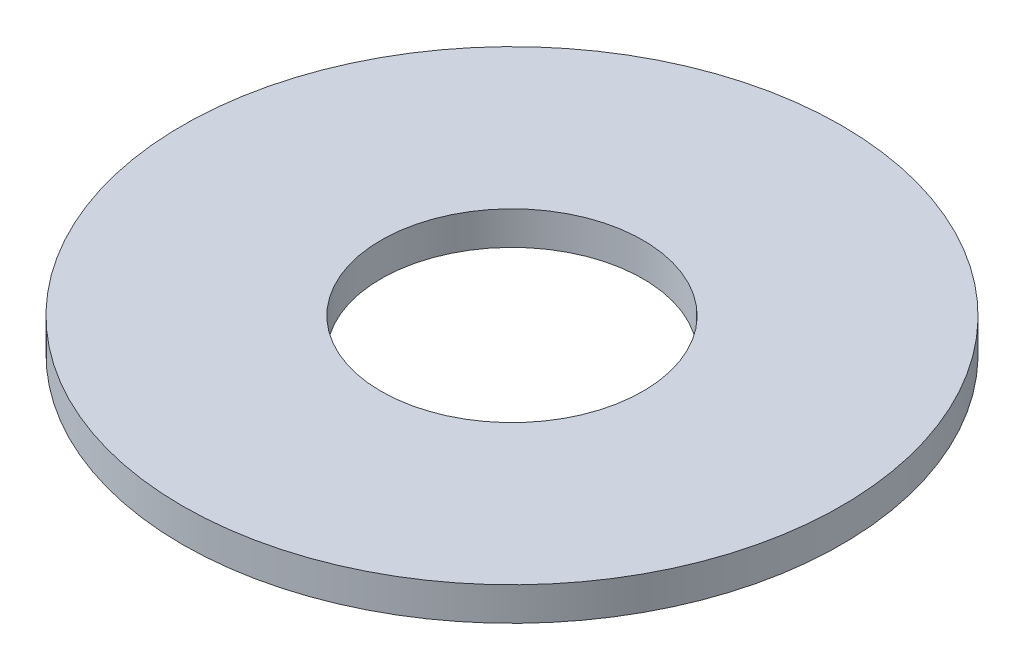
ISO-10303-21;
HEADER;
FILE_DESCRIPTION(('STEP AP214'),'2;1');
FILE_NAME('part.step','',(''),(''),'','','');
FILE_SCHEMA(('AUTOMOTIVE_DESIGN { 1 0 10303 214 1 1 1 1 }'));
ENDSEC;
DATA;
#1=APPLICATION_CONTEXT('core data for automotive mechanical design processes');
#2=APPLICATION_PROTOCOL_DEFINITION('international standard','automotive_design',2000,#1);
#3=PRODUCT_CONTEXT('',#1,'mechanical');
#4=PRODUCT('Part','Part','',(#3));
#5=PRODUCT_RELATED_PRODUCT_CATEGORY('part','',(#4));
#6=PRODUCT_DEFINITION_FORMATION('','',#4);
#7=PRODUCT_DEFINITION_CONTEXT('part definition',#1,'design');
#8=PRODUCT_DEFINITION('design','',#6,#7);
#9=PRODUCT_DEFINITION_SHAPE('','',#8);
#10=(LENGTH_UNIT() NAMED_UNIT(*) SI_UNIT(.MILLI.,.METRE.));
#11=(NAMED_UNIT(*) PLANE_ANGLE_UNIT() SI_UNIT($,.RADIAN.));
#12=(NAMED_UNIT(*) SI_UNIT($,.STERADIAN.) SOLID_ANGLE_UNIT());
#13=UNCERTAINTY_MEASURE_WITH_UNIT(LENGTH_MEASURE(1.E-05),#10,'distance_accuracy_value','');
#14=(GEOMETRIC_REPRESENTATION_CONTEXT(3) GLOBAL_UNCERTAINTY_ASSIGNED_CONTEXT((#13)) GLOBAL_UNIT_ASSIGNED_CONTEXT((#10,
#11,#12)) REPRESENTATION_CONTEXT('',''));
#15=CARTESIAN_POINT('',(0.,0.,0.));
#16=DIRECTION('',(0.,0.,1.));
#17=DIRECTION('',(1.,0.,0.));
#18=AXIS2_PLACEMENT_3D('',#15,#16,#17);
#19=CARTESIAN_POINT('',(0.,0.4826,0.));
#20=DIRECTION('',(0.,-1.,0.));
#21=DIRECTION('',(0.,0.,-1.));
#22=AXIS2_PLACEMENT_3D('',#19,#20,#21);
#23=CYLINDRICAL_SURFACE('',#22,4.7625);
#24=CARTESIAN_POINT('',(0.,0.4826,0.));
#25=DIRECTION('',(0.,1.,0.));
#26=DIRECTION('',(0.,0.,1.));
#27=AXIS2_PLACEMENT_3D('',#24,#25,#26);
#28=CIRCLE('',#27,4.7625);
#29=CARTESIAN_POINT('',(0.,0.4826,-4.7625));
#30=VERTEX_POINT('',#29);
#31=EDGE_CURVE('E12',#30,#30,#28,.T.);
#32=CARTESIAN_POINT('',(0.,0.,0.));
#33=DIRECTION('',(0.,1.,0.));
#34=DIRECTION('',(0.,0.,1.));
#35=AXIS2_PLACEMENT_3D('',#32,#33,#34);
#36=CIRCLE('',#35,4.7625);
#37=CARTESIAN_POINT('',(0.,0.,-4.7625));
#38=VERTEX_POINT('',#37);
#39=EDGE_CURVE('E45',#38,#38,#36,.T.);
#40=CARTESIAN_POINT('',(0.,0.4826,-4.7625));
#41=CARTESIAN_POINT('',(0.,0.477572916666667,-4.7625));
#42=CARTESIAN_POINT('',(0.,0.472545833333333,-4.7625));
#43=CARTESIAN_POINT('',(0.,0.462491666666667,-4.7625));
#44=CARTESIAN_POINT('',(0.,0.457464583333333,-4.7625));
#45=CARTESIAN_POINT('',(0.,0.447410416666667,-4.7625));
#46=CARTESIAN_POINT('',(0.,0.442383333333333,-4.7625));
#47=CARTESIAN_POINT('',(0.,0.432329166666667,-4.7625));
#48=CARTESIAN_POINT('',(0.,0.427302083333333,-4.7625));
#49=CARTESIAN_POINT('',(0.,0.417247916666667,-4.7625));
#50=CARTESIAN_POINT('',(0.,0.412220833333333,-4.7625));
#51=CARTESIAN_POINT('',(0.,0.402166666666667,-4.7625));
#52=CARTESIAN_POINT('',(0.,0.397139583333333,-4.7625));
#53=CARTESIAN_POINT('',(0.,0.387085416666667,-4.7625));
#54=CARTESIAN_POINT('',(0.,0.382058333333333,-4.7625));
#55=CARTESIAN_POINT('',(0.,0.372004166666667,-4.7625));
#56=CARTESIAN_POINT('',(0.,0.366977083333333,-4.7625));
#57=CARTESIAN_POINT('',(0.,0.356922916666667,-4.7625));
#58=CARTESIAN_POINT('',(0.,0.351895833333333,-4.7625));
#59=CARTESIAN_POINT('',(0.,0.341841666666667,-4.7625));
#60=CARTESIAN_POINT('',(0.,0.336814583333333,-4.7625));
#61=CARTESIAN_POINT('',(0.,0.326760416666667,-4.7625));
#62=CARTESIAN_POINT('',(0.,0.321733333333333,-4.7625));
#63=CARTESIAN_POINT('',(0.,0.311679166666667,-4.7625));
#64=CARTESIAN_POINT('',(0.,0.306652083333333,-4.7625));
#65=CARTESIAN_POINT('',(0.,0.296597916666667,-4.7625));
#66=CARTESIAN_POINT('',(0.,0.291570833333333,-4.7625));
#67=CARTESIAN_POINT('',(0.,0.281516666666667,-4.7625));
#68=CARTESIAN_POINT('',(0.,0.276489583333333,-4.7625));
#69=CARTESIAN_POINT('',(0.,0.266435416666667,-4.7625));
#70=CARTESIAN_POINT('',(0.,0.261408333333333,-4.7625));
#71=CARTESIAN_POINT('',(0.,0.251354166666667,-4.7625));
#72=CARTESIAN_POINT('',(0.,0.246327083333333,-4.7625));
#73=CARTESIAN_POINT('',(0.,0.236272916666667,-4.7625));
#74=CARTESIAN_POINT('',(0.,0.231245833333333,-4.7625));
#75=CARTESIAN_POINT('',(0.,0.221191666666667,-4.7625));
#76=CARTESIAN_POINT('',(0.,0.216164583333333,-4.7625));
#77=CARTESIAN_POINT('',(0.,0.206110416666667,-4.7625));
#78=CARTESIAN_POINT('',(0.,0.201083333333333,-4.7625));
#79=CARTESIAN_POINT('',(0.,0.191029166666667,-4.7625));
#80=CARTESIAN_POINT('',(0.,0.186002083333333,-4.7625));
#81=CARTESIAN_POINT('',(0.,0.175947916666667,-4.7625));
#82=CARTESIAN_POINT('',(0.,0.170920833333333,-4.7625));
#83=CARTESIAN_POINT('',(0.,0.160866666666667,-4.7625));
#84=CARTESIAN_POINT('',(0.,0.155839583333333,-4.7625));
#85=CARTESIAN_POINT('',(0.,0.145785416666667,-4.7625));
#86=CARTESIAN_POINT('',(0.,0.140758333333333,-4.7625));
#87=CARTESIAN_POINT('',(0.,0.130704166666667,-4.7625));
#88=CARTESIAN_POINT('',(0.,0.125677083333333,-4.7625));
#89=CARTESIAN_POINT('',(0.,0.115622916666667,-4.7625));
#90=CARTESIAN_POINT('',(0.,0.110595833333333,-4.7625));
#91=CARTESIAN_POINT('',(0.,0.100541666666667,-4.7625));
#92=CARTESIAN_POINT('',(0.,0.0955145833333333,-4.7625));
#93=CARTESIAN_POINT('',(0.,0.0854604166666667,-4.7625));
#94=CARTESIAN_POINT('',(0.,0.0804333333333333,-4.7625));
#95=CARTESIAN_POINT('',(0.,0.0703791666666667,-4.7625));
#96=CARTESIAN_POINT('',(0.,0.0653520833333334,-4.7625));
#97=CARTESIAN_POINT('',(0.,0.0552979166666667,-4.7625));
#98=CARTESIAN_POINT('',(0.,0.0502708333333334,-4.7625));
#99=CARTESIAN_POINT('',(0.,0.0402166666666667,-4.7625));
#100=CARTESIAN_POINT('',(0.,0.0351895833333333,-4.7625));
#101=CARTESIAN_POINT('',(0.,0.0251354166666666,-4.7625));
#102=CARTESIAN_POINT('',(0.,0.0201083333333333,-4.7625));
#103=CARTESIAN_POINT('',(0.,0.0100541666666667,-4.7625));
#104=CARTESIAN_POINT('',(0.,0.00502708333333333,-4.7625));
#105=CARTESIAN_POINT('',(0.,0.,-4.7625));
#106=B_SPLINE_CURVE_WITH_KNOTS('',3,(#40,#41,#42,#43,#44,#45,#46,#47,#48,#49,#50,#51,#52,#53,
#54,#55,#56,#57,#58,#59,#60,#61,#62,#63,#64,#65,#66,#67,#68,#69,#70,#71,#72,#73,#74,#75,#76,#77,
#78,#79,#80,#81,#82,#83,#84,#85,#86,#87,#88,#89,#90,#91,#92,#93,#94,#95,#96,#97,#98,#99,#100,
#101,#102,#103,#104,#105),.UNSPECIFIED.,.F.,.F.,(4,2,2,2,2,2,2,2,2,2,2,2,2,2,2,2,2,2,2,2,2,2,2,
2,2,2,2,2,2,2,2,2,4),(0.,0.01508125,0.0301625,0.04524375,0.060325,0.07540625,0.0904875,
0.10556875,0.12065,0.13573125,0.1508125,0.16589375,0.180975,0.19605625,0.2111375,0.22621875,
0.2413,0.25638125,0.2714625,0.28654375,0.301625,0.31670625,0.3317875,0.34686875,0.36195,
0.37703125,0.3921125,0.40719375,0.422275,0.43735625,0.4524375,0.46751875,0.4826),.UNSPECIFIED.);
#107=EDGE_CURVE('BSEAM42',#30,#38,#106,.T.);
#108=ORIENTED_EDGE('',*,*,#31,.F.);
#109=ORIENTED_EDGE('',*,*,#39,.T.);
#110=ORIENTED_EDGE('',*,*,#107,.T.);
#111=ORIENTED_EDGE('',*,*,#107,.F.);
#112=EDGE_LOOP('',(#108,#110,#109,#111));
#113=FACE_BOUND('',#112,.T.);
#114=ADVANCED_FACE('F42',(#113),#23,.T.);
#115=CARTESIAN_POINT('',(0.,0.4826,0.));
#116=DIRECTION('',(0.,1.,0.));
#117=DIRECTION('',(0.,0.,1.));
#118=AXIS2_PLACEMENT_3D('',#115,#116,#117);
#119=PLANE('',#118);
#120=CARTESIAN_POINT('',(0.,0.4826,0.));
#121=DIRECTION('',(0.,1.,0.));
#122=DIRECTION('',(0.,0.,1.));
#123=AXIS2_PLACEMENT_3D('',#120,#121,#122);
#124=CIRCLE('',#123,1.8923);
#125=CARTESIAN_POINT('',(0.,0.4826,1.8923));
#126=VERTEX_POINT('',#125);
#127=EDGE_CURVE('E54',#126,#126,#124,.T.);
#128=ORIENTED_EDGE('',*,*,#127,.F.);
#129=EDGE_LOOP('',(#128));
#130=FACE_BOUND('',#129,.T.);
#131=ORIENTED_EDGE('',*,*,#31,.T.);
#132=EDGE_LOOP('',(#131));
#133=FACE_BOUND('',#132,.T.);
#134=ADVANCED_FACE('F69',(#130,#133),#119,.T.);
#135=CARTESIAN_POINT('',(0.,0.,0.));
#136=DIRECTION('',(0.,1.,0.));
#137=DIRECTION('',(0.,0.,1.));
#138=AXIS2_PLACEMENT_3D('',#135,#136,#137);
#139=PLANE('',#138);
#140=CARTESIAN_POINT('',(0.,0.,0.));
#141=DIRECTION('',(0.,1.,0.));
#142=DIRECTION('',(0.,0.,1.));
#143=AXIS2_PLACEMENT_3D('',#140,#141,#142);
#144=CIRCLE('',#143,1.8923);
#145=CARTESIAN_POINT('',(0.,0.,1.8923));
#146=VERTEX_POINT('',#145);
#147=EDGE_CURVE('E52',#146,#146,#144,.T.);
#148=ORIENTED_EDGE('',*,*,#147,.T.);
#149=EDGE_LOOP('',(#148));
#150=FACE_BOUND('',#149,.T.);
#151=ORIENTED_EDGE('',*,*,#39,.F.);
#152=EDGE_LOOP('',(#151));
#153=FACE_BOUND('',#152,.T.);
#154=ADVANCED_FACE('F60',(#150,#153),#139,.F.);
#155=CARTESIAN_POINT('',(0.,0.,0.));
#156=DIRECTION('',(0.,1.,0.));
#157=DIRECTION('',(0.,0.,1.));
#158=AXIS2_PLACEMENT_3D('',#155,#156,#157);
#159=CYLINDRICAL_SURFACE('',#158,1.8923);
#160=CARTESIAN_POINT('',(0.,0.,1.8923));
#161=CARTESIAN_POINT('',(0.,0.00502708333333333,1.8923));
#162=CARTESIAN_POINT('',(0.,0.0100541666666667,1.8923));
#163=CARTESIAN_POINT('',(0.,0.0201083333333333,1.8923));
#164=CARTESIAN_POINT('',(0.,0.0251354166666667,1.8923));
#165=CARTESIAN_POINT('',(0.,0.0351895833333333,1.8923));
#166=CARTESIAN_POINT('',(0.,0.0402166666666667,1.8923));
#167=CARTESIAN_POINT('',(0.,0.0502708333333333,1.8923));
#168=CARTESIAN_POINT('',(0.,0.0552979166666667,1.8923));
#169=CARTESIAN_POINT('',(0.,0.0653520833333333,1.8923));
#170=CARTESIAN_POINT('',(0.,0.0703791666666667,1.8923));
#171=CARTESIAN_POINT('',(0.,0.0804333333333333,1.8923));
#172=CARTESIAN_POINT('',(0.,0.0854604166666666,1.8923));
#173=CARTESIAN_POINT('',(0.,0.0955145833333333,1.8923));
#174=CARTESIAN_POINT('',(0.,0.100541666666667,1.8923));
#175=CARTESIAN_POINT('',(0.,0.110595833333333,1.8923));
#176=CARTESIAN_POINT('',(0.,0.115622916666667,1.8923));
#177=CARTESIAN_POINT('',(0.,0.125677083333333,1.8923));
#178=CARTESIAN_POINT('',(0.,0.130704166666667,1.8923));
#179=CARTESIAN_POINT('',(0.,0.140758333333333,1.8923));
#180=CARTESIAN_POINT('',(0.,0.145785416666667,1.8923));
#181=CARTESIAN_POINT('',(0.,0.155839583333333,1.8923));
#182=CARTESIAN_POINT('',(0.,0.160866666666667,1.8923));
#183=CARTESIAN_POINT('',(0.,0.170920833333333,1.8923));
#184=CARTESIAN_POINT('',(0.,0.175947916666667,1.8923));
#185=CARTESIAN_POINT('',(0.,0.186002083333333,1.8923));
#186=CARTESIAN_POINT('',(0.,0.191029166666667,1.8923));
#187=CARTESIAN_POINT('',(0.,0.201083333333333,1.8923));
#188=CARTESIAN_POINT('',(0.,0.206110416666667,1.8923));
#189=CARTESIAN_POINT('',(0.,0.216164583333333,1.8923));
#190=CARTESIAN_POINT('',(0.,0.221191666666667,1.8923));
#191=CARTESIAN_POINT('',(0.,0.231245833333333,1.8923));
#192=CARTESIAN_POINT('',(0.,0.236272916666667,1.8923));
#193=CARTESIAN_POINT('',(0.,0.246327083333333,1.8923));
#194=CARTESIAN_POINT('',(0.,0.251354166666667,1.8923));
#195=CARTESIAN_POINT('',(0.,0.261408333333333,1.8923));
#196=CARTESIAN_POINT('',(0.,0.266435416666667,1.8923));
#197=CARTESIAN_POINT('',(0.,0.276489583333333,1.8923));
#198=CARTESIAN_POINT('',(0.,0.281516666666667,1.8923));
#199=CARTESIAN_POINT('',(0.,0.291570833333333,1.8923));
#200=CARTESIAN_POINT('',(0.,0.296597916666667,1.8923));
#201=CARTESIAN_POINT('',(0.,0.306652083333333,1.8923));
#202=CARTESIAN_POINT('',(0.,0.311679166666667,1.8923));
#203=CARTESIAN_POINT('',(0.,0.321733333333333,1.8923));
#204=CARTESIAN_POINT('',(0.,0.326760416666667,1.8923));
#205=CARTESIAN_POINT('',(0.,0.336814583333333,1.8923));
#206=CARTESIAN_POINT('',(0.,0.341841666666667,1.8923));
#207=CARTESIAN_POINT('',(0.,0.351895833333333,1.8923));
#208=CARTESIAN_POINT('',(0.,0.356922916666667,1.8923));
#209=CARTESIAN_POINT('',(0.,0.366977083333333,1.8923));
#210=CARTESIAN_POINT('',(0.,0.372004166666667,1.8923));
#211=CARTESIAN_POINT('',(0.,0.382058333333333,1.8923));
#212=CARTESIAN_POINT('',(0.,0.387085416666667,1.8923));
#213=CARTESIAN_POINT('',(0.,0.397139583333333,1.8923));
#214=CARTESIAN_POINT('',(0.,0.402166666666667,1.8923));
#215=CARTESIAN_POINT('',(0.,0.412220833333333,1.8923));
#216=CARTESIAN_POINT('',(0.,0.417247916666667,1.8923));
#217=CARTESIAN_POINT('',(0.,0.427302083333333,1.8923));
#218=CARTESIAN_POINT('',(0.,0.432329166666667,1.8923));
#219=CARTESIAN_POINT('',(0.,0.442383333333333,1.8923));
#220=CARTESIAN_POINT('',(0.,0.447410416666667,1.8923));
#221=CARTESIAN_POINT('',(0.,0.457464583333333,1.8923));
#222=CARTESIAN_POINT('',(0.,0.462491666666667,1.8923));
#223=CARTESIAN_POINT('',(0.,0.472545833333333,1.8923));
#224=CARTESIAN_POINT('',(0.,0.477572916666667,1.8923));
#225=CARTESIAN_POINT('',(0.,0.4826,1.8923));
#226=B_SPLINE_CURVE_WITH_KNOTS('',3,(#160,#161,#162,#163,#164,#165,#166,#167,#168,#169,#170,
#171,#172,#173,#174,#175,#176,#177,#178,#179,#180,#181,#182,#183,#184,#185,#186,#187,#188,#189,
#190,#191,#192,#193,#194,#195,#196,#197,#198,#199,#200,#201,#202,#203,#204,#205,#206,#207,#208,
#209,#210,#211,#212,#213,#214,#215,#216,#217,#218,#219,#220,#221,#222,#223,#224,#225),
.UNSPECIFIED.,.F.,.F.,(4,2,2,2,2,2,2,2,2,2,2,2,2,2,2,2,2,2,2,2,2,2,2,2,2,2,2,2,2,2,2,2,4),(0.,
0.01508125,0.0301625,0.04524375,0.060325,0.07540625,0.0904875,0.10556875,0.12065,0.13573125,
0.1508125,0.16589375,0.180975,0.19605625,0.2111375,0.22621875,0.2413,0.25638125,0.2714625,
0.28654375,0.301625,0.31670625,0.3317875,0.34686875,0.36195,0.37703125,0.3921125,0.40719375,
0.422275,0.43735625,0.4524375,0.46751875,0.4826),.UNSPECIFIED.);
#227=EDGE_CURVE('BSEAM63',#146,#126,#226,.T.);
#228=ORIENTED_EDGE('',*,*,#147,.F.);
#229=ORIENTED_EDGE('',*,*,#127,.T.);
#230=ORIENTED_EDGE('',*,*,#227,.T.);
#231=ORIENTED_EDGE('',*,*,#227,.F.);
#232=EDGE_LOOP('',(#228,#230,#229,#231));
#233=FACE_BOUND('',#232,.T.);
#234=ADVANCED_FACE('F63',(#233),#159,.F.);
#235=CLOSED_SHELL('',(#114,#134,#154,#234));
#236=MANIFOLD_SOLID_BREP('B2',#235);
#237=ADVANCED_BREP_SHAPE_REPRESENTATION('',(#18,#236),#14);
#238=SHAPE_DEFINITION_REPRESENTATION(#9,#237);
ENDSEC;
END-ISO-10303-21;
